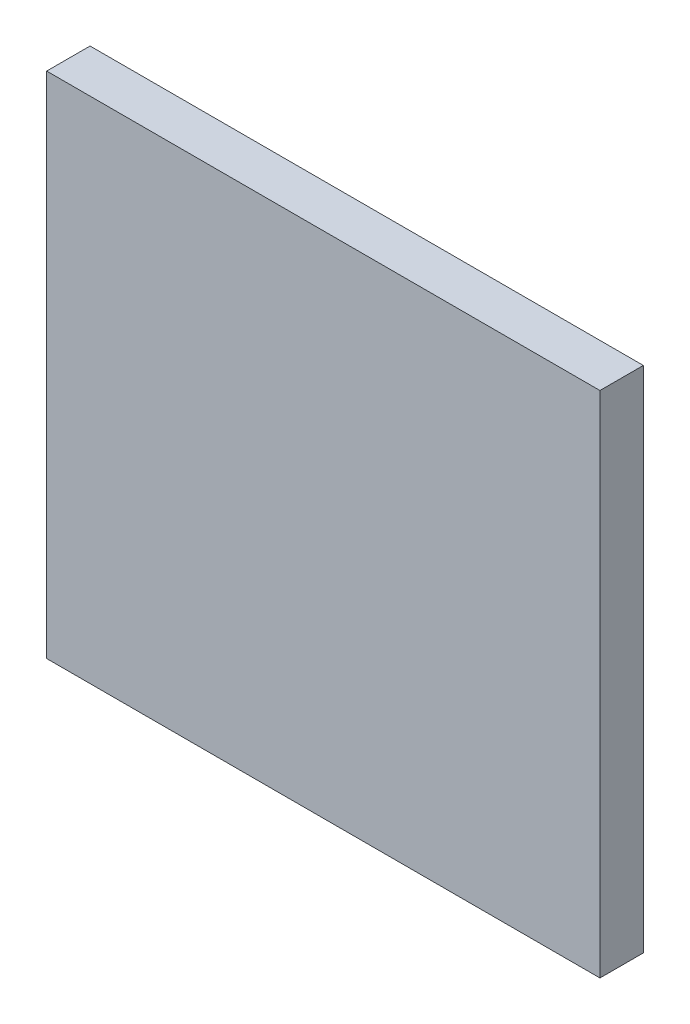
ISO-10303-21;
HEADER;
FILE_DESCRIPTION(('STEP AP214'),'2;1');
FILE_NAME('part.step','',(''),(''),'','','');
FILE_SCHEMA(('AUTOMOTIVE_DESIGN { 1 0 10303 214 1 1 1 1 }'));
ENDSEC;
DATA;
#1=APPLICATION_CONTEXT('core data for automotive mechanical design processes');
#2=APPLICATION_PROTOCOL_DEFINITION('international standard','automotive_design',2000,#1);
#3=PRODUCT_CONTEXT('',#1,'mechanical');
#4=PRODUCT('Part','Part','',(#3));
#5=PRODUCT_RELATED_PRODUCT_CATEGORY('part','',(#4));
#6=PRODUCT_DEFINITION_FORMATION('','',#4);
#7=PRODUCT_DEFINITION_CONTEXT('part definition',#1,'design');
#8=PRODUCT_DEFINITION('design','',#6,#7);
#9=PRODUCT_DEFINITION_SHAPE('','',#8);
#10=(LENGTH_UNIT() NAMED_UNIT(*) SI_UNIT(.MILLI.,.METRE.));
#11=(NAMED_UNIT(*) PLANE_ANGLE_UNIT() SI_UNIT($,.RADIAN.));
#12=(NAMED_UNIT(*) SI_UNIT($,.STERADIAN.) SOLID_ANGLE_UNIT());
#13=UNCERTAINTY_MEASURE_WITH_UNIT(LENGTH_MEASURE(1.E-05),#10,'distance_accuracy_value','');
#14=(GEOMETRIC_REPRESENTATION_CONTEXT(3) GLOBAL_UNCERTAINTY_ASSIGNED_CONTEXT((#13)) GLOBAL_UNIT_ASSIGNED_CONTEXT((#10,
#11,#12)) REPRESENTATION_CONTEXT('',''));
#15=CARTESIAN_POINT('',(0.,0.,0.));
#16=DIRECTION('',(0.,0.,1.));
#17=DIRECTION('',(1.,0.,0.));
#18=AXIS2_PLACEMENT_3D('',#15,#16,#17);
#19=CARTESIAN_POINT('',(182.828437887551,-106.46048787105,2.));
#20=DIRECTION('',(-1.,0.,0.));
#21=DIRECTION('',(0.,0.,1.));
#22=AXIS2_PLACEMENT_3D('',#19,#20,#21);
#23=PLANE('',#22);
#24=DIRECTION('',(0.,1.,0.));
#25=VECTOR('',#24,1.);
#26=CARTESIAN_POINT('',(182.828437887551,-106.46048787105,0.));
#27=LINE('',#26,#25);
#28=CARTESIAN_POINT('',(182.828437887551,-106.46048787105,0.));
#29=VERTEX_POINT('',#28);
#30=CARTESIAN_POINT('',(182.828437887551,-83.0104878710502,0.));
#31=VERTEX_POINT('',#30);
#32=EDGE_CURVE('E98',#29,#31,#27,.T.);
#33=ORIENTED_EDGE('',*,*,#32,.T.);
#34=DIRECTION('',(0.,0.,-1.));
#35=VECTOR('',#34,1.);
#36=CARTESIAN_POINT('',(182.828437887551,-83.0104878710502,2.));
#37=LINE('',#36,#35);
#38=CARTESIAN_POINT('',(182.828437887551,-83.0104878710502,2.));
#39=VERTEX_POINT('',#38);
#40=EDGE_CURVE('E11',#39,#31,#37,.T.);
#41=ORIENTED_EDGE('',*,*,#40,.F.);
#42=DIRECTION('',(0.,1.,0.));
#43=VECTOR('',#42,1.);
#44=CARTESIAN_POINT('',(182.828437887551,-106.46048787105,2.));
#45=LINE('',#44,#43);
#46=CARTESIAN_POINT('',(182.828437887551,-106.46048787105,2.));
#47=VERTEX_POINT('',#46);
#48=EDGE_CURVE('E86',#47,#39,#45,.T.);
#49=ORIENTED_EDGE('',*,*,#48,.F.);
#50=DIRECTION('',(0.,0.,-1.));
#51=VECTOR('',#50,1.);
#52=CARTESIAN_POINT('',(182.828437887551,-106.46048787105,2.));
#53=LINE('',#52,#51);
#54=EDGE_CURVE('E94',#47,#29,#53,.T.);
#55=ORIENTED_EDGE('',*,*,#54,.T.);
#56=EDGE_LOOP('',(#33,#41,#49,#55));
#57=FACE_BOUND('',#56,.T.);
#58=ADVANCED_FACE('F35',(#57),#23,.F.);
#59=CARTESIAN_POINT('',(182.828437887551,-83.0104878710502,2.));
#60=DIRECTION('',(0.,-1.,0.));
#61=DIRECTION('',(1.,0.,0.));
#62=AXIS2_PLACEMENT_3D('',#59,#60,#61);
#63=PLANE('',#62);
#64=DIRECTION('',(-1.,0.,0.));
#65=VECTOR('',#64,1.);
#66=CARTESIAN_POINT('',(182.828437887551,-83.0104878710502,0.));
#67=LINE('',#66,#65);
#68=CARTESIAN_POINT('',(157.328437887551,-83.0104878710502,0.));
#69=VERTEX_POINT('',#68);
#70=EDGE_CURVE('E90',#31,#69,#67,.T.);
#71=ORIENTED_EDGE('',*,*,#70,.T.);
#72=DIRECTION('',(0.,0.,-1.));
#73=VECTOR('',#72,1.);
#74=CARTESIAN_POINT('',(157.328437887551,-83.0104878710502,2.));
#75=LINE('',#74,#73);
#76=CARTESIAN_POINT('',(157.328437887551,-83.0104878710502,2.));
#77=VERTEX_POINT('',#76);
#78=EDGE_CURVE('E43',#77,#69,#75,.T.);
#79=ORIENTED_EDGE('',*,*,#78,.F.);
#80=DIRECTION('',(-1.,0.,0.));
#81=VECTOR('',#80,1.);
#82=CARTESIAN_POINT('',(182.828437887551,-83.0104878710502,2.));
#83=LINE('',#82,#81);
#84=EDGE_CURVE('E81',#39,#77,#83,.T.);
#85=ORIENTED_EDGE('',*,*,#84,.F.);
#86=ORIENTED_EDGE('',*,*,#40,.T.);
#87=EDGE_LOOP('',(#71,#79,#85,#86));
#88=FACE_BOUND('',#87,.T.);
#89=ADVANCED_FACE('F89',(#88),#63,.F.);
#90=CARTESIAN_POINT('',(157.328437887551,-106.46048787105,2.));
#91=DIRECTION('',(1.,0.,0.));
#92=DIRECTION('',(0.,0.,-1.));
#93=AXIS2_PLACEMENT_3D('',#90,#91,#92);
#94=PLANE('',#93);
#95=DIRECTION('',(0.,-1.,0.));
#96=VECTOR('',#95,1.);
#97=CARTESIAN_POINT('',(157.328437887551,-106.46048787105,0.));
#98=LINE('',#97,#96);
#99=CARTESIAN_POINT('',(157.328437887551,-106.46048787105,0.));
#100=VERTEX_POINT('',#99);
#101=EDGE_CURVE('E68',#69,#100,#98,.T.);
#102=ORIENTED_EDGE('',*,*,#101,.T.);
#103=DIRECTION('',(0.,0.,-1.));
#104=VECTOR('',#103,1.);
#105=CARTESIAN_POINT('',(157.328437887551,-106.46048787105,2.));
#106=LINE('',#105,#104);
#107=CARTESIAN_POINT('',(157.328437887551,-106.46048787105,2.));
#108=VERTEX_POINT('',#107);
#109=EDGE_CURVE('E91',#108,#100,#106,.T.);
#110=ORIENTED_EDGE('',*,*,#109,.F.);
#111=DIRECTION('',(0.,-1.,0.));
#112=VECTOR('',#111,1.);
#113=CARTESIAN_POINT('',(157.328437887551,-106.46048787105,2.));
#114=LINE('',#113,#112);
#115=EDGE_CURVE('E84',#77,#108,#114,.T.);
#116=ORIENTED_EDGE('',*,*,#115,.F.);
#117=ORIENTED_EDGE('',*,*,#78,.T.);
#118=EDGE_LOOP('',(#102,#110,#116,#117));
#119=FACE_BOUND('',#118,.T.);
#120=ADVANCED_FACE('F92',(#119),#94,.F.);
#121=CARTESIAN_POINT('',(182.828437887551,-106.46048787105,2.));
#122=DIRECTION('',(0.,1.,0.));
#123=DIRECTION('',(0.,0.,1.));
#124=AXIS2_PLACEMENT_3D('',#121,#122,#123);
#125=PLANE('',#124);
#126=DIRECTION('',(1.,0.,0.));
#127=VECTOR('',#126,1.);
#128=CARTESIAN_POINT('',(182.828437887551,-106.46048787105,0.));
#129=LINE('',#128,#127);
#130=EDGE_CURVE('E74',#100,#29,#129,.T.);
#131=ORIENTED_EDGE('',*,*,#130,.T.);
#132=ORIENTED_EDGE('',*,*,#54,.F.);
#133=DIRECTION('',(1.,0.,0.));
#134=VECTOR('',#133,1.);
#135=CARTESIAN_POINT('',(182.828437887551,-106.46048787105,2.));
#136=LINE('',#135,#134);
#137=EDGE_CURVE('E51',#108,#47,#136,.T.);
#138=ORIENTED_EDGE('',*,*,#137,.F.);
#139=ORIENTED_EDGE('',*,*,#109,.T.);
#140=EDGE_LOOP('',(#131,#132,#138,#139));
#141=FACE_BOUND('',#140,.T.);
#142=ADVANCED_FACE('F105',(#141),#125,.F.);
#143=CARTESIAN_POINT('',(0.,0.,2.));
#144=DIRECTION('',(0.,0.,1.));
#145=DIRECTION('',(1.,0.,0.));
#146=AXIS2_PLACEMENT_3D('',#143,#144,#145);
#147=PLANE('',#146);
#148=ORIENTED_EDGE('',*,*,#48,.T.);
#149=ORIENTED_EDGE('',*,*,#84,.T.);
#150=ORIENTED_EDGE('',*,*,#115,.T.);
#151=ORIENTED_EDGE('',*,*,#137,.T.);
#152=EDGE_LOOP('',(#148,#149,#150,#151));
#153=FACE_BOUND('',#152,.T.);
#154=ADVANCED_FACE('F82',(#153),#147,.T.);
#155=CARTESIAN_POINT('',(0.,0.,0.));
#156=DIRECTION('',(0.,0.,1.));
#157=DIRECTION('',(1.,0.,0.));
#158=AXIS2_PLACEMENT_3D('',#155,#156,#157);
#159=PLANE('',#158);
#160=ORIENTED_EDGE('',*,*,#32,.F.);
#161=ORIENTED_EDGE('',*,*,#130,.F.);
#162=ORIENTED_EDGE('',*,*,#101,.F.);
#163=ORIENTED_EDGE('',*,*,#70,.F.);
#164=EDGE_LOOP('',(#160,#161,#162,#163));
#165=FACE_BOUND('',#164,.T.);
#166=ADVANCED_FACE('F108',(#165),#159,.F.);
#167=CLOSED_SHELL('',(#58,#89,#120,#142,#154,#166));
#168=MANIFOLD_SOLID_BREP('B2',#167);
#169=ADVANCED_BREP_SHAPE_REPRESENTATION('',(#18,#168),#14);
#170=SHAPE_DEFINITION_REPRESENTATION(#9,#169);
ENDSEC;
END-ISO-10303-21;
